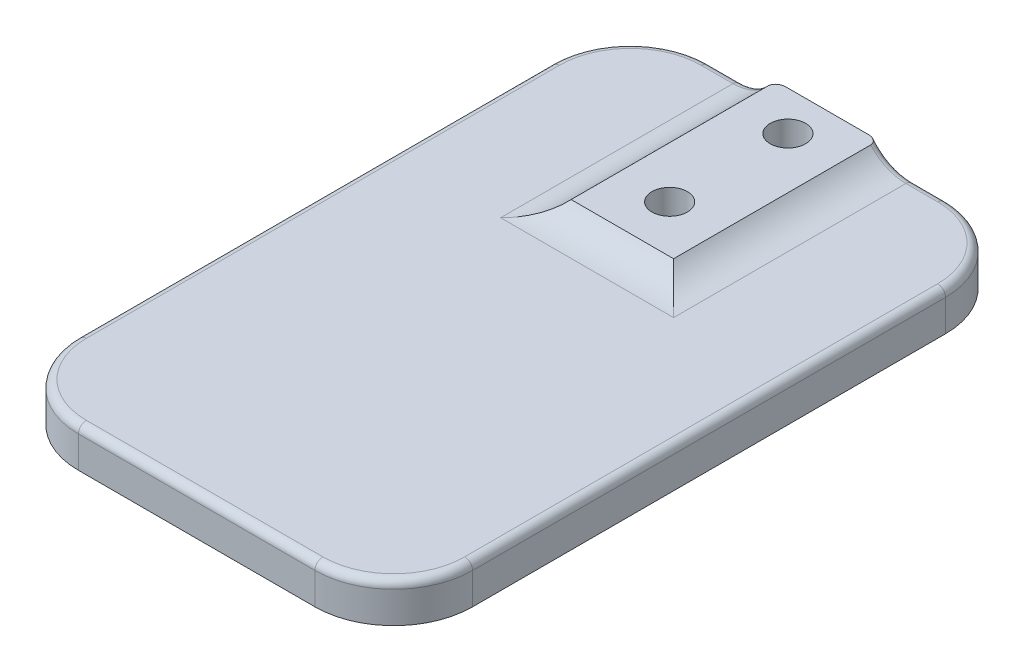
ISO-10303-21;
HEADER;
FILE_DESCRIPTION(('STEP AP214'),'2;1');
FILE_NAME('part.step','',(''),(''),'','','');
FILE_SCHEMA(('AUTOMOTIVE_DESIGN { 1 0 10303 214 1 1 1 1 }'));
ENDSEC;
DATA;
#1=APPLICATION_CONTEXT('core data for automotive mechanical design processes');
#2=APPLICATION_PROTOCOL_DEFINITION('international standard','automotive_design',2000,#1);
#3=PRODUCT_CONTEXT('',#1,'mechanical');
#4=PRODUCT('Part','Part','',(#3));
#5=PRODUCT_RELATED_PRODUCT_CATEGORY('part','',(#4));
#6=PRODUCT_DEFINITION_FORMATION('','',#4);
#7=PRODUCT_DEFINITION_CONTEXT('part definition',#1,'design');
#8=PRODUCT_DEFINITION('design','',#6,#7);
#9=PRODUCT_DEFINITION_SHAPE('','',#8);
#10=(LENGTH_UNIT() NAMED_UNIT(*) SI_UNIT(.MILLI.,.METRE.));
#11=(NAMED_UNIT(*) PLANE_ANGLE_UNIT() SI_UNIT($,.RADIAN.));
#12=(NAMED_UNIT(*) SI_UNIT($,.STERADIAN.) SOLID_ANGLE_UNIT());
#13=UNCERTAINTY_MEASURE_WITH_UNIT(LENGTH_MEASURE(1.E-05),#10,'distance_accuracy_value','');
#14=(GEOMETRIC_REPRESENTATION_CONTEXT(3) GLOBAL_UNCERTAINTY_ASSIGNED_CONTEXT((#13)) GLOBAL_UNIT_ASSIGNED_CONTEXT((#10,
#11,#12)) REPRESENTATION_CONTEXT('',''));
#15=CARTESIAN_POINT('',(0.,0.,0.));
#16=DIRECTION('',(0.,0.,1.));
#17=DIRECTION('',(1.,0.,0.));
#18=AXIS2_PLACEMENT_3D('',#15,#16,#17);
#19=CARTESIAN_POINT('',(25.,5.,-40.));
#20=DIRECTION('',(-1.,0.,0.));
#21=DIRECTION('',(0.,0.,1.));
#22=AXIS2_PLACEMENT_3D('',#19,#20,#21);
#23=PLANE('',#22);
#24=DIRECTION('',(0.,-1.,0.));
#25=VECTOR('',#24,1.);
#26=CARTESIAN_POINT('',(25.,5.,-30.));
#27=LINE('',#26,#25);
#28=CARTESIAN_POINT('',(25.,0.,-30.));
#29=VERTEX_POINT('',#28);
#30=CARTESIAN_POINT('',(25.,4.,-30.));
#31=VERTEX_POINT('',#30);
#32=EDGE_CURVE('E241',#29,#31,#27,.F.);
#33=ORIENTED_EDGE('',*,*,#32,.T.);
#34=DIRECTION('',(0.,0.,-1.));
#35=VECTOR('',#34,1.);
#36=CARTESIAN_POINT('',(25.,4.,30.));
#37=LINE('',#36,#35);
#38=CARTESIAN_POINT('',(25.,4.,30.));
#39=VERTEX_POINT('',#38);
#40=EDGE_CURVE('E460',#31,#39,#37,.F.);
#41=ORIENTED_EDGE('',*,*,#40,.T.);
#42=DIRECTION('',(0.,-1.,0.));
#43=VECTOR('',#42,1.);
#44=CARTESIAN_POINT('',(25.,5.,30.));
#45=LINE('',#44,#43);
#46=CARTESIAN_POINT('',(25.,0.,30.));
#47=VERTEX_POINT('',#46);
#48=EDGE_CURVE('E238',#39,#47,#45,.T.);
#49=ORIENTED_EDGE('',*,*,#48,.T.);
#50=DIRECTION('',(0.,0.,-1.));
#51=VECTOR('',#50,1.);
#52=CARTESIAN_POINT('',(25.,0.,-40.));
#53=LINE('',#52,#51);
#54=EDGE_CURVE('E200',#47,#29,#53,.T.);
#55=ORIENTED_EDGE('',*,*,#54,.T.);
#56=EDGE_LOOP('',(#33,#41,#49,#55));
#57=FACE_BOUND('',#56,.T.);
#58=ADVANCED_FACE('F42',(#57),#23,.F.);
#59=CARTESIAN_POINT('',(-25.,5.,-40.));
#60=DIRECTION('',(0.,0.,1.));
#61=DIRECTION('',(1.,0.,0.));
#62=AXIS2_PLACEMENT_3D('',#59,#60,#61);
#63=PLANE('',#62);
#64=DIRECTION('',(-1.,0.,0.));
#65=VECTOR('',#64,1.);
#66=CARTESIAN_POINT('',(-10.9721359549987,4.,-40.));
#67=LINE('',#66,#65);
#68=CARTESIAN_POINT('',(-15.,4.,-40.));
#69=VERTEX_POINT('',#68);
#70=CARTESIAN_POINT('',(-10.9721359549987,4.,-40.));
#71=VERTEX_POINT('',#70);
#72=EDGE_CURVE('E274',#69,#71,#67,.F.);
#73=ORIENTED_EDGE('',*,*,#72,.T.);
#74=CARTESIAN_POINT('',(-10.9721359549987,11.,-40.));
#75=DIRECTION('',(0.,0.,1.));
#76=DIRECTION('',(1.,0.,0.));
#77=AXIS2_PLACEMENT_3D('',#74,#75,#76);
#78=CIRCLE('',#77,7.);
#79=CARTESIAN_POINT('',(-5.22757330846066,7.,-40.));
#80=VERTEX_POINT('',#79);
#81=EDGE_CURVE('E277',#71,#80,#78,.T.);
#82=ORIENTED_EDGE('',*,*,#81,.T.);
#83=DIRECTION('',(-1.,0.,0.));
#84=VECTOR('',#83,1.);
#85=CARTESIAN_POINT('',(-6.49999999999911,7.,-40.));
#86=LINE('',#85,#84);
#87=CARTESIAN_POINT('',(5.22757330846243,7.,-40.));
#88=VERTEX_POINT('',#87);
#89=EDGE_CURVE('E182',#88,#80,#86,.T.);
#90=ORIENTED_EDGE('',*,*,#89,.F.);
#91=CARTESIAN_POINT('',(10.9721359550005,11.,-40.));
#92=DIRECTION('',(0.,0.,1.));
#93=DIRECTION('',(1.,0.,0.));
#94=AXIS2_PLACEMENT_3D('',#91,#92,#93);
#95=CIRCLE('',#94,7.);
#96=CARTESIAN_POINT('',(10.9721359550005,4.,-40.));
#97=VERTEX_POINT('',#96);
#98=EDGE_CURVE('E271',#88,#97,#95,.T.);
#99=ORIENTED_EDGE('',*,*,#98,.T.);
#100=DIRECTION('',(-1.,0.,0.));
#101=VECTOR('',#100,1.);
#102=CARTESIAN_POINT('',(15.,4.,-40.));
#103=LINE('',#102,#101);
#104=CARTESIAN_POINT('',(15.,4.,-40.));
#105=VERTEX_POINT('',#104);
#106=EDGE_CURVE('E265',#97,#105,#103,.F.);
#107=ORIENTED_EDGE('',*,*,#106,.T.);
#108=DIRECTION('',(0.,-1.,0.));
#109=VECTOR('',#108,1.);
#110=CARTESIAN_POINT('',(15.,5.,-40.));
#111=LINE('',#110,#109);
#112=CARTESIAN_POINT('',(15.,0.,-40.));
#113=VERTEX_POINT('',#112);
#114=EDGE_CURVE('E223',#105,#113,#111,.T.);
#115=ORIENTED_EDGE('',*,*,#114,.T.);
#116=DIRECTION('',(-1.,0.,0.));
#117=VECTOR('',#116,1.);
#118=CARTESIAN_POINT('',(-25.,0.,-40.));
#119=LINE('',#118,#117);
#120=CARTESIAN_POINT('',(-15.,0.,-40.));
#121=VERTEX_POINT('',#120);
#122=EDGE_CURVE('E204',#113,#121,#119,.T.);
#123=ORIENTED_EDGE('',*,*,#122,.T.);
#124=DIRECTION('',(0.,-1.,0.));
#125=VECTOR('',#124,1.);
#126=CARTESIAN_POINT('',(-15.,5.,-40.));
#127=LINE('',#126,#125);
#128=EDGE_CURVE('E219',#121,#69,#127,.F.);
#129=ORIENTED_EDGE('',*,*,#128,.T.);
#130=EDGE_LOOP('',(#73,#82,#90,#99,#107,#115,#123,#129));
#131=FACE_BOUND('',#130,.T.);
#132=ADVANCED_FACE('F321',(#131),#63,.F.);
#133=CARTESIAN_POINT('',(-25.,5.,-40.));
#134=DIRECTION('',(1.,0.,0.));
#135=DIRECTION('',(0.,0.,-1.));
#136=AXIS2_PLACEMENT_3D('',#133,#134,#135);
#137=PLANE('',#136);
#138=DIRECTION('',(0.,-1.,0.));
#139=VECTOR('',#138,1.);
#140=CARTESIAN_POINT('',(-25.,5.,30.));
#141=LINE('',#140,#139);
#142=CARTESIAN_POINT('',(-25.,0.,30.));
#143=VERTEX_POINT('',#142);
#144=CARTESIAN_POINT('',(-25.,4.,30.));
#145=VERTEX_POINT('',#144);
#146=EDGE_CURVE('E254',#143,#145,#141,.F.);
#147=ORIENTED_EDGE('',*,*,#146,.T.);
#148=DIRECTION('',(0.,0.,1.));
#149=VECTOR('',#148,1.);
#150=CARTESIAN_POINT('',(-25.,4.,-30.));
#151=LINE('',#150,#149);
#152=CARTESIAN_POINT('',(-25.,4.,-30.));
#153=VERTEX_POINT('',#152);
#154=EDGE_CURVE('E418',#145,#153,#151,.F.);
#155=ORIENTED_EDGE('',*,*,#154,.T.);
#156=DIRECTION('',(0.,-1.,0.));
#157=VECTOR('',#156,1.);
#158=CARTESIAN_POINT('',(-25.,5.,-30.));
#159=LINE('',#158,#157);
#160=CARTESIAN_POINT('',(-25.,0.,-30.));
#161=VERTEX_POINT('',#160);
#162=EDGE_CURVE('E251',#153,#161,#159,.T.);
#163=ORIENTED_EDGE('',*,*,#162,.T.);
#164=DIRECTION('',(0.,0.,1.));
#165=VECTOR('',#164,1.);
#166=CARTESIAN_POINT('',(-25.,0.,-40.));
#167=LINE('',#166,#165);
#168=EDGE_CURVE('E211',#161,#143,#167,.T.);
#169=ORIENTED_EDGE('',*,*,#168,.T.);
#170=EDGE_LOOP('',(#147,#155,#163,#169));
#171=FACE_BOUND('',#170,.T.);
#172=ADVANCED_FACE('F318',(#171),#137,.F.);
#173=CARTESIAN_POINT('',(-25.,5.,40.));
#174=DIRECTION('',(0.,0.,-1.));
#175=DIRECTION('',(-1.,0.,0.));
#176=AXIS2_PLACEMENT_3D('',#173,#174,#175);
#177=PLANE('',#176);
#178=DIRECTION('',(0.,-1.,0.));
#179=VECTOR('',#178,1.);
#180=CARTESIAN_POINT('',(15.,5.,40.));
#181=LINE('',#180,#179);
#182=CARTESIAN_POINT('',(15.,0.,40.));
#183=VERTEX_POINT('',#182);
#184=CARTESIAN_POINT('',(15.,4.,40.));
#185=VERTEX_POINT('',#184);
#186=EDGE_CURVE('E248',#183,#185,#181,.F.);
#187=ORIENTED_EDGE('',*,*,#186,.T.);
#188=DIRECTION('',(1.,0.,0.));
#189=VECTOR('',#188,1.);
#190=CARTESIAN_POINT('',(-15.,4.,40.));
#191=LINE('',#190,#189);
#192=CARTESIAN_POINT('',(-15.,4.,40.));
#193=VERTEX_POINT('',#192);
#194=EDGE_CURVE('E67',#185,#193,#191,.F.);
#195=ORIENTED_EDGE('',*,*,#194,.T.);
#196=DIRECTION('',(0.,-1.,0.));
#197=VECTOR('',#196,1.);
#198=CARTESIAN_POINT('',(-15.,5.,40.));
#199=LINE('',#198,#197);
#200=CARTESIAN_POINT('',(-15.,0.,40.));
#201=VERTEX_POINT('',#200);
#202=EDGE_CURVE('E245',#193,#201,#199,.T.);
#203=ORIENTED_EDGE('',*,*,#202,.T.);
#204=DIRECTION('',(1.,0.,0.));
#205=VECTOR('',#204,1.);
#206=CARTESIAN_POINT('',(-25.,0.,40.));
#207=LINE('',#206,#205);
#208=EDGE_CURVE('E215',#201,#183,#207,.T.);
#209=ORIENTED_EDGE('',*,*,#208,.T.);
#210=EDGE_LOOP('',(#187,#195,#203,#209));
#211=FACE_BOUND('',#210,.T.);
#212=ADVANCED_FACE('F311',(#211),#177,.F.);
#213=CARTESIAN_POINT('',(0.,5.,0.));
#214=DIRECTION('',(0.,1.,0.));
#215=DIRECTION('',(0.,0.,1.));
#216=AXIS2_PLACEMENT_3D('',#213,#214,#215);
#217=PLANE('',#216);
#218=DIRECTION('',(0.,0.,1.));
#219=VECTOR('',#218,1.);
#220=CARTESIAN_POINT('',(-10.9721359549987,5.,-40.));
#221=LINE('',#220,#219);
#222=CARTESIAN_POINT('',(-10.9721359549987,5.,-9.52786404499976));
#223=VERTEX_POINT('',#222);
#224=CARTESIAN_POINT('',(-10.9721359549987,5.,-39.));
#225=VERTEX_POINT('',#224);
#226=EDGE_CURVE('E189',#223,#225,#221,.F.);
#227=ORIENTED_EDGE('',*,*,#226,.T.);
#228=DIRECTION('',(-1.,0.,0.));
#229=VECTOR('',#228,1.);
#230=CARTESIAN_POINT('',(-15.,5.,-39.));
#231=LINE('',#230,#229);
#232=CARTESIAN_POINT('',(-15.,5.,-39.));
#233=VERTEX_POINT('',#232);
#234=EDGE_CURVE('E448',#225,#233,#231,.T.);
#235=ORIENTED_EDGE('',*,*,#234,.T.);
#236=CARTESIAN_POINT('',(-15.,5.,-30.));
#237=DIRECTION('',(0.,1.,0.));
#238=DIRECTION('',(0.,0.,1.));
#239=AXIS2_PLACEMENT_3D('',#236,#237,#238);
#240=CIRCLE('',#239,9.);
#241=CARTESIAN_POINT('',(-24.,5.,-30.));
#242=VERTEX_POINT('',#241);
#243=EDGE_CURVE('E454',#233,#242,#240,.T.);
#244=ORIENTED_EDGE('',*,*,#243,.T.);
#245=DIRECTION('',(0.,0.,1.));
#246=VECTOR('',#245,1.);
#247=CARTESIAN_POINT('',(-24.,5.,30.));
#248=LINE('',#247,#246);
#249=CARTESIAN_POINT('',(-24.,5.,30.));
#250=VERTEX_POINT('',#249);
#251=EDGE_CURVE('E519',#242,#250,#248,.T.);
#252=ORIENTED_EDGE('',*,*,#251,.T.);
#253=CARTESIAN_POINT('',(-15.,5.,30.));
#254=DIRECTION('',(0.,1.,0.));
#255=DIRECTION('',(0.,0.,1.));
#256=AXIS2_PLACEMENT_3D('',#253,#254,#255);
#257=CIRCLE('',#256,9.);
#258=CARTESIAN_POINT('',(-15.,5.,39.));
#259=VERTEX_POINT('',#258);
#260=EDGE_CURVE('E525',#250,#259,#257,.T.);
#261=ORIENTED_EDGE('',*,*,#260,.T.);
#262=DIRECTION('',(1.,0.,0.));
#263=VECTOR('',#262,1.);
#264=CARTESIAN_POINT('',(15.,5.,39.));
#265=LINE('',#264,#263);
#266=CARTESIAN_POINT('',(15.,5.,39.));
#267=VERTEX_POINT('',#266);
#268=EDGE_CURVE('E530',#259,#267,#265,.T.);
#269=ORIENTED_EDGE('',*,*,#268,.T.);
#270=CARTESIAN_POINT('',(15.,5.,30.));
#271=DIRECTION('',(0.,1.,0.));
#272=DIRECTION('',(0.,0.,1.));
#273=AXIS2_PLACEMENT_3D('',#270,#271,#272);
#274=CIRCLE('',#273,9.);
#275=CARTESIAN_POINT('',(24.,5.,30.));
#276=VERTEX_POINT('',#275);
#277=EDGE_CURVE('E513',#267,#276,#274,.T.);
#278=ORIENTED_EDGE('',*,*,#277,.T.);
#279=DIRECTION('',(0.,0.,-1.));
#280=VECTOR('',#279,1.);
#281=CARTESIAN_POINT('',(24.,5.,-30.));
#282=LINE('',#281,#280);
#283=CARTESIAN_POINT('',(24.,5.,-30.));
#284=VERTEX_POINT('',#283);
#285=EDGE_CURVE('E504',#276,#284,#282,.T.);
#286=ORIENTED_EDGE('',*,*,#285,.T.);
#287=CARTESIAN_POINT('',(15.,5.,-30.));
#288=DIRECTION('',(0.,1.,0.));
#289=DIRECTION('',(0.,0.,1.));
#290=AXIS2_PLACEMENT_3D('',#287,#288,#289);
#291=CIRCLE('',#290,9.);
#292=CARTESIAN_POINT('',(15.,5.,-39.));
#293=VERTEX_POINT('',#292);
#294=EDGE_CURVE('E507',#284,#293,#291,.T.);
#295=ORIENTED_EDGE('',*,*,#294,.T.);
#296=DIRECTION('',(-1.,0.,0.));
#297=VECTOR('',#296,1.);
#298=CARTESIAN_POINT('',(10.9721359550005,5.,-39.));
#299=LINE('',#298,#297);
#300=CARTESIAN_POINT('',(10.9721359550005,5.,-39.));
#301=VERTEX_POINT('',#300);
#302=EDGE_CURVE('E401',#293,#301,#299,.T.);
#303=ORIENTED_EDGE('',*,*,#302,.T.);
#304=DIRECTION('',(0.,0.,-1.));
#305=VECTOR('',#304,1.);
#306=CARTESIAN_POINT('',(10.9721359550005,5.,-13.9999999999993));
#307=LINE('',#306,#305);
#308=CARTESIAN_POINT('',(10.9721359550005,5.,-9.52786404499976));
#309=VERTEX_POINT('',#308);
#310=EDGE_CURVE('E262',#301,#309,#307,.F.);
#311=ORIENTED_EDGE('',*,*,#310,.T.);
#312=DIRECTION('',(1.,0.,0.));
#313=VECTOR('',#312,1.);
#314=CARTESIAN_POINT('',(-6.49999999999911,5.,-9.52786404499976));
#315=LINE('',#314,#313);
#316=EDGE_CURVE('E259',#309,#223,#315,.F.);
#317=ORIENTED_EDGE('',*,*,#316,.T.);
#318=EDGE_LOOP('',(#227,#235,#244,#252,#261,#269,#278,#286,#295,#303,#311,#317));
#319=FACE_BOUND('',#318,.T.);
#320=ADVANCED_FACE('F307',(#319),#217,.T.);
#321=CARTESIAN_POINT('',(0.,0.,0.));
#322=DIRECTION('',(0.,1.,0.));
#323=DIRECTION('',(0.,0.,1.));
#324=AXIS2_PLACEMENT_3D('',#321,#322,#323);
#325=PLANE('',#324);
#326=CARTESIAN_POINT('',(0.,0.,-35.));
#327=DIRECTION('',(0.,1.,0.));
#328=DIRECTION('',(0.,0.,1.));
#329=AXIS2_PLACEMENT_3D('',#326,#327,#328);
#330=CIRCLE('',#329,4.65000000000002);
#331=CARTESIAN_POINT('',(0.,0.,-30.35));
#332=VERTEX_POINT('',#331);
#333=EDGE_CURVE('E417',#332,#332,#330,.T.);
#334=ORIENTED_EDGE('',*,*,#333,.T.);
#335=EDGE_LOOP('',(#334));
#336=FACE_BOUND('',#335,.T.);
#337=CARTESIAN_POINT('',(0.,0.,-20.));
#338=DIRECTION('',(0.,1.,0.));
#339=DIRECTION('',(0.,0.,1.));
#340=AXIS2_PLACEMENT_3D('',#337,#338,#339);
#341=CIRCLE('',#340,4.64999999999999);
#342=CARTESIAN_POINT('',(0.,0.,-15.35));
#343=VERTEX_POINT('',#342);
#344=EDGE_CURVE('E413',#343,#343,#341,.T.);
#345=ORIENTED_EDGE('',*,*,#344,.T.);
#346=EDGE_LOOP('',(#345));
#347=FACE_BOUND('',#346,.T.);
#348=ORIENTED_EDGE('',*,*,#122,.F.);
#349=CARTESIAN_POINT('',(15.,0.,-30.));
#350=DIRECTION('',(0.,1.,0.));
#351=DIRECTION('',(0.,0.,1.));
#352=AXIS2_PLACEMENT_3D('',#349,#350,#351);
#353=CIRCLE('',#352,10.);
#354=EDGE_CURVE('E235',#113,#29,#353,.F.);
#355=ORIENTED_EDGE('',*,*,#354,.T.);
#356=ORIENTED_EDGE('',*,*,#54,.F.);
#357=CARTESIAN_POINT('',(15.,0.,30.));
#358=DIRECTION('',(0.,1.,0.));
#359=DIRECTION('',(0.,0.,1.));
#360=AXIS2_PLACEMENT_3D('',#357,#358,#359);
#361=CIRCLE('',#360,10.);
#362=EDGE_CURVE('E232',#47,#183,#361,.F.);
#363=ORIENTED_EDGE('',*,*,#362,.T.);
#364=ORIENTED_EDGE('',*,*,#208,.F.);
#365=CARTESIAN_POINT('',(-15.,0.,30.));
#366=DIRECTION('',(0.,1.,0.));
#367=DIRECTION('',(0.,0.,1.));
#368=AXIS2_PLACEMENT_3D('',#365,#366,#367);
#369=CIRCLE('',#368,10.);
#370=EDGE_CURVE('E229',#201,#143,#369,.F.);
#371=ORIENTED_EDGE('',*,*,#370,.T.);
#372=ORIENTED_EDGE('',*,*,#168,.F.);
#373=CARTESIAN_POINT('',(-15.,0.,-30.));
#374=DIRECTION('',(0.,1.,0.));
#375=DIRECTION('',(0.,0.,1.));
#376=AXIS2_PLACEMENT_3D('',#373,#374,#375);
#377=CIRCLE('',#376,10.);
#378=EDGE_CURVE('E226',#161,#121,#377,.F.);
#379=ORIENTED_EDGE('',*,*,#378,.T.);
#380=EDGE_LOOP('',(#348,#355,#356,#363,#364,#371,#372,#379));
#381=FACE_BOUND('',#380,.T.);
#382=ADVANCED_FACE('F304',(#336,#347,#381),#325,.F.);
#383=CARTESIAN_POINT('',(0.,7.,0.));
#384=DIRECTION('',(0.,-1.,0.));
#385=DIRECTION('',(0.,0.,-1.));
#386=AXIS2_PLACEMENT_3D('',#383,#384,#385);
#387=PLANE('',#386);
#388=CARTESIAN_POINT('',(0.,7.,-35.));
#389=DIRECTION('',(0.,1.,0.));
#390=DIRECTION('',(0.,0.,1.));
#391=AXIS2_PLACEMENT_3D('',#388,#389,#390);
#392=CIRCLE('',#391,2.25);
#393=CARTESIAN_POINT('',(0.,7.,-32.75));
#394=VERTEX_POINT('',#393);
#395=EDGE_CURVE('E555',#394,#394,#392,.T.);
#396=ORIENTED_EDGE('',*,*,#395,.F.);
#397=EDGE_LOOP('',(#396));
#398=FACE_BOUND('',#397,.T.);
#399=CARTESIAN_POINT('',(0.,7.,-20.));
#400=DIRECTION('',(0.,1.,0.));
#401=DIRECTION('',(0.,0.,1.));
#402=AXIS2_PLACEMENT_3D('',#399,#400,#401);
#403=CIRCLE('',#402,2.25);
#404=CARTESIAN_POINT('',(0.,7.,-17.75));
#405=VERTEX_POINT('',#404);
#406=EDGE_CURVE('E193',#405,#405,#403,.T.);
#407=ORIENTED_EDGE('',*,*,#406,.F.);
#408=EDGE_LOOP('',(#407));
#409=FACE_BOUND('',#408,.T.);
#410=ORIENTED_EDGE('',*,*,#89,.T.);
#411=CARTESIAN_POINT('',(-5.22757330846066,7.,-40.));
#412=CARTESIAN_POINT('',(-5.31218436696525,7.,-39.9999572097328));
#413=CARTESIAN_POINT('',(-5.39679405095857,7.,-39.992763275864));
#414=CARTESIAN_POINT('',(-5.56427663479689,7.,-39.964317357309));
#415=CARTESIAN_POINT('',(-5.64713150329684,7.,-39.9429592021294));
#416=CARTESIAN_POINT('',(-5.80798814044717,7.,-39.8864491257726));
#417=CARTESIAN_POINT('',(-5.8859915270889,7.,-39.8513018322249));
#418=CARTESIAN_POINT('',(-6.03407136235752,7.,-39.7672637397689));
#419=CARTESIAN_POINT('',(-6.10417375514118,7.,-39.7184198752765));
#420=CARTESIAN_POINT('',(-6.21044209037377,7.,-39.6261423973338));
#421=CARTESIAN_POINT('',(-6.25000134362256,7.,-39.586598338663));
#422=CARTESIAN_POINT('',(-6.32236665913547,7.,-39.5017207429351));
#423=CARTESIAN_POINT('',(-6.35518121048792,7.,-39.4563946013506));
#424=CARTESIAN_POINT('',(-6.40714772390656,7.,-39.3688653325679));
#425=CARTESIAN_POINT('',(-6.42768244729932,7.,-39.3274853017424));
#426=CARTESIAN_POINT('',(-6.46157896103236,7.,-39.2419098203217));
#427=CARTESIAN_POINT('',(-6.4749554482319,7.,-39.1977203483597));
#428=CARTESIAN_POINT('',(-6.48947043945153,7.,-39.1276268971672));
#429=CARTESIAN_POINT('',(-6.49340493646582,7.,-39.102278244798));
#430=CARTESIAN_POINT('',(-6.49867464708532,7.,-39.0512922491416));
#431=CARTESIAN_POINT('',(-6.50000774772438,7.,-39.0256546881742));
#432=CARTESIAN_POINT('',(-6.49999999999911,7.,-39.));
#433=B_SPLINE_CURVE_WITH_KNOTS('',3,(#411,#412,#413,#414,#415,#416,#417,#418,#419,#420,#421,
#422,#423,#424,#425,#426,#427,#428,#429,#430,#431,#432),.UNSPECIFIED.,.F.,.F.,(4,2,2,2,2,2,2,2,
2,2,4),(0.,0.253550994624207,0.509024338504201,0.764412018868951,1.01893503065254,
1.18616716680131,1.35318751285431,1.4912229328746,1.62897384884644,1.70580915518309,
1.78270684453003),.UNSPECIFIED.);
#434=CARTESIAN_POINT('',(-6.49999999999911,7.,-39.));
#435=VERTEX_POINT('',#434);
#436=EDGE_CURVE('E178',#80,#435,#433,.T.);
#437=ORIENTED_EDGE('',*,*,#436,.T.);
#438=DIRECTION('',(0.,0.,1.));
#439=VECTOR('',#438,1.);
#440=CARTESIAN_POINT('',(-6.49999999999911,7.,-13.9999999999993));
#441=LINE('',#440,#439);
#442=CARTESIAN_POINT('',(-6.49999999999911,7.,-13.9999999999993));
#443=VERTEX_POINT('',#442);
#444=EDGE_CURVE('E170',#435,#443,#441,.T.);
#445=ORIENTED_EDGE('',*,*,#444,.T.);
#446=DIRECTION('',(1.,0.,0.));
#447=VECTOR('',#446,1.);
#448=CARTESIAN_POINT('',(-6.49999999999911,7.,-13.9999999999993));
#449=LINE('',#448,#447);
#450=CARTESIAN_POINT('',(6.50000000000089,7.,-13.9999999999993));
#451=VERTEX_POINT('',#450);
#452=EDGE_CURVE('E176',#443,#451,#449,.T.);
#453=ORIENTED_EDGE('',*,*,#452,.T.);
#454=DIRECTION('',(0.,0.,-1.));
#455=VECTOR('',#454,1.);
#456=CARTESIAN_POINT('',(6.50000000000089,7.,-13.9999999999993));
#457=LINE('',#456,#455);
#458=CARTESIAN_POINT('',(6.50000000000089,7.,-39.));
#459=VERTEX_POINT('',#458);
#460=EDGE_CURVE('E553',#451,#459,#457,.T.);
#461=ORIENTED_EDGE('',*,*,#460,.T.);
#462=CARTESIAN_POINT('',(6.50000000000089,7.,-39.));
#463=CARTESIAN_POINT('',(6.50000449826011,7.,-39.0234011522832));
#464=CARTESIAN_POINT('',(6.49889700539802,7.,-39.0467880998812));
#465=CARTESIAN_POINT('',(6.49450991604656,7.,-39.093339788144));
#466=CARTESIAN_POINT('',(6.49123198653924,7.,-39.1165046855112));
#467=CARTESIAN_POINT('',(6.47829592403575,7.,-39.1850154257283));
#468=CARTESIAN_POINT('',(6.46553341465789,7.,-39.2298055649736));
#469=CARTESIAN_POINT('',(6.43271143611399,7.,-39.3164143014299));
#470=CARTESIAN_POINT('',(6.41267179985191,7.,-39.3582406093925));
#471=CARTESIAN_POINT('',(6.36645568683535,7.,-39.4384289924918));
#472=CARTESIAN_POINT('',(6.34026547090611,7.,-39.4767830415844));
#473=CARTESIAN_POINT('',(6.27203775565736,7.,-39.5633748961934));
#474=CARTESIAN_POINT('',(6.22775702636054,7.,-39.6098451159085));
#475=CARTESIAN_POINT('',(6.13226747575128,7.,-39.6950149687189));
#476=CARTESIAN_POINT('',(6.08104663946532,7.,-39.7337008300232));
#477=CARTESIAN_POINT('',(5.96014160409359,7.,-39.8119669199484));
#478=CARTESIAN_POINT('',(5.88904094033407,7.,-39.8493578530595));
#479=CARTESIAN_POINT('',(5.74171218893063,7.,-39.9119797222805));
#480=CARTESIAN_POINT('',(5.66548268069208,7.,-39.9372072734276));
#481=CARTESIAN_POINT('',(5.5288005629267,7.,-39.9707608830408));
#482=CARTESIAN_POINT('',(5.46897367349475,7.,-39.9816950653583));
#483=CARTESIAN_POINT('',(5.34862997766931,7.,-39.9962967626379));
#484=CARTESIAN_POINT('',(5.28811590028555,7.,-39.9999868031388));
#485=CARTESIAN_POINT('',(5.22757330846244,7.,-40.));
#486=B_SPLINE_CURVE_WITH_KNOTS('',3,(#462,#463,#464,#465,#466,#467,#468,#469,#470,#471,#472,
#473,#474,#475,#476,#477,#478,#479,#480,#481,#482,#483,#484,#485),.UNSPECIFIED.,.F.,.F.,(4,2,2,
2,2,2,2,2,2,2,2,4),(0.,0.070150414102945,0.140247012284642,0.279175239474848,0.417727642344912,
0.556592538204348,0.748118446291941,0.939980271889822,1.17975574389847,1.41959790486153,
1.60163276750004,1.78310069353373),.UNSPECIFIED.);
#487=EDGE_CURVE('E281',#459,#88,#486,.T.);
#488=ORIENTED_EDGE('',*,*,#487,.T.);
#489=EDGE_LOOP('',(#410,#437,#445,#453,#461,#488));
#490=FACE_BOUND('',#489,.T.);
#491=ADVANCED_FACE('F173',(#398,#409,#490),#387,.F.);
#492=CARTESIAN_POINT('',(0.,0.,-20.));
#493=DIRECTION('',(0.,1.,0.));
#494=DIRECTION('',(0.,0.,1.));
#495=AXIS2_PLACEMENT_3D('',#492,#493,#494);
#496=CYLINDRICAL_SURFACE('',#495,2.25);
#497=CARTESIAN_POINT('',(0.,2.4,-20.));
#498=DIRECTION('',(0.,1.,0.));
#499=DIRECTION('',(0.,0.,1.));
#500=AXIS2_PLACEMENT_3D('',#497,#498,#499);
#501=CIRCLE('',#500,2.25);
#502=CARTESIAN_POINT('',(0.,2.4,-17.75));
#503=VERTEX_POINT('',#502);
#504=EDGE_CURVE('E11',#503,#503,#501,.F.);
#505=ORIENTED_EDGE('',*,*,#504,.T.);
#506=EDGE_LOOP('',(#505));
#507=FACE_BOUND('',#506,.T.);
#508=ORIENTED_EDGE('',*,*,#406,.T.);
#509=EDGE_LOOP('',(#508));
#510=FACE_BOUND('',#509,.T.);
#511=ADVANCED_FACE('F303',(#507,#510),#496,.F.);
#512=CARTESIAN_POINT('',(0.,0.,-35.));
#513=DIRECTION('',(0.,1.,0.));
#514=DIRECTION('',(0.,0.,1.));
#515=AXIS2_PLACEMENT_3D('',#512,#513,#514);
#516=CYLINDRICAL_SURFACE('',#515,2.25);
#517=CARTESIAN_POINT('',(0.,2.40000000000002,-35.));
#518=DIRECTION('',(0.,1.,0.));
#519=DIRECTION('',(0.,0.,1.));
#520=AXIS2_PLACEMENT_3D('',#517,#518,#519);
#521=CIRCLE('',#520,2.25);
#522=CARTESIAN_POINT('',(0.,2.40000000000002,-32.75));
#523=VERTEX_POINT('',#522);
#524=EDGE_CURVE('E52',#523,#523,#521,.F.);
#525=ORIENTED_EDGE('',*,*,#524,.T.);
#526=EDGE_LOOP('',(#525));
#527=FACE_BOUND('',#526,.T.);
#528=ORIENTED_EDGE('',*,*,#395,.T.);
#529=EDGE_LOOP('',(#528));
#530=FACE_BOUND('',#529,.T.);
#531=ADVANCED_FACE('F333',(#527,#530),#516,.F.);
#532=CARTESIAN_POINT('',(15.,5.,-30.));
#533=DIRECTION('',(0.,-1.,0.));
#534=DIRECTION('',(0.,0.,-1.));
#535=AXIS2_PLACEMENT_3D('',#532,#533,#534);
#536=CYLINDRICAL_SURFACE('',#535,10.);
#537=ORIENTED_EDGE('',*,*,#114,.F.);
#538=CARTESIAN_POINT('',(15.,4.,-30.));
#539=DIRECTION('',(0.,1.,0.));
#540=DIRECTION('',(0.,0.,1.));
#541=AXIS2_PLACEMENT_3D('',#538,#539,#540);
#542=CIRCLE('',#541,10.);
#543=EDGE_CURVE('E452',#105,#31,#542,.F.);
#544=ORIENTED_EDGE('',*,*,#543,.T.);
#545=ORIENTED_EDGE('',*,*,#32,.F.);
#546=ORIENTED_EDGE('',*,*,#354,.F.);
#547=EDGE_LOOP('',(#537,#544,#545,#546));
#548=FACE_BOUND('',#547,.T.);
#549=ADVANCED_FACE('F329',(#548),#536,.T.);
#550=CARTESIAN_POINT('',(15.,5.,30.));
#551=DIRECTION('',(0.,-1.,0.));
#552=DIRECTION('',(0.,0.,-1.));
#553=AXIS2_PLACEMENT_3D('',#550,#551,#552);
#554=CYLINDRICAL_SURFACE('',#553,10.);
#555=ORIENTED_EDGE('',*,*,#48,.F.);
#556=CARTESIAN_POINT('',(15.,4.,30.));
#557=DIRECTION('',(0.,1.,0.));
#558=DIRECTION('',(0.,0.,1.));
#559=AXIS2_PLACEMENT_3D('',#556,#557,#558);
#560=CIRCLE('',#559,10.);
#561=EDGE_CURVE('E463',#39,#185,#560,.F.);
#562=ORIENTED_EDGE('',*,*,#561,.T.);
#563=ORIENTED_EDGE('',*,*,#186,.F.);
#564=ORIENTED_EDGE('',*,*,#362,.F.);
#565=EDGE_LOOP('',(#555,#562,#563,#564));
#566=FACE_BOUND('',#565,.T.);
#567=ADVANCED_FACE('F332',(#566),#554,.T.);
#568=CARTESIAN_POINT('',(-15.,5.,30.));
#569=DIRECTION('',(0.,-1.,0.));
#570=DIRECTION('',(0.,0.,-1.));
#571=AXIS2_PLACEMENT_3D('',#568,#569,#570);
#572=CYLINDRICAL_SURFACE('',#571,10.);
#573=ORIENTED_EDGE('',*,*,#202,.F.);
#574=CARTESIAN_POINT('',(-15.,4.,30.));
#575=DIRECTION('',(0.,1.,0.));
#576=DIRECTION('',(0.,0.,1.));
#577=AXIS2_PLACEMENT_3D('',#574,#575,#576);
#578=CIRCLE('',#577,10.);
#579=EDGE_CURVE('E59',#193,#145,#578,.F.);
#580=ORIENTED_EDGE('',*,*,#579,.T.);
#581=ORIENTED_EDGE('',*,*,#146,.F.);
#582=ORIENTED_EDGE('',*,*,#370,.F.);
#583=EDGE_LOOP('',(#573,#580,#581,#582));
#584=FACE_BOUND('',#583,.T.);
#585=ADVANCED_FACE('F337',(#584),#572,.T.);
#586=CARTESIAN_POINT('',(-15.,5.,-30.));
#587=DIRECTION('',(0.,-1.,0.));
#588=DIRECTION('',(0.,0.,-1.));
#589=AXIS2_PLACEMENT_3D('',#586,#587,#588);
#590=CYLINDRICAL_SURFACE('',#589,10.);
#591=ORIENTED_EDGE('',*,*,#162,.F.);
#592=CARTESIAN_POINT('',(-15.,4.,-30.));
#593=DIRECTION('',(0.,1.,0.));
#594=DIRECTION('',(0.,0.,1.));
#595=AXIS2_PLACEMENT_3D('',#592,#593,#594);
#596=CIRCLE('',#595,10.);
#597=EDGE_CURVE('E443',#153,#69,#596,.F.);
#598=ORIENTED_EDGE('',*,*,#597,.T.);
#599=ORIENTED_EDGE('',*,*,#128,.F.);
#600=ORIENTED_EDGE('',*,*,#378,.F.);
#601=EDGE_LOOP('',(#591,#598,#599,#600));
#602=FACE_BOUND('',#601,.T.);
#603=ADVANCED_FACE('F341',(#602),#590,.T.);
#604=CARTESIAN_POINT('',(-10.9721359549987,11.,-13.9999999999993));
#605=DIRECTION('',(0.,0.,-1.));
#606=DIRECTION('',(-1.,0.,0.));
#607=AXIS2_PLACEMENT_3D('',#604,#605,#606);
#608=CYLINDRICAL_SURFACE('',#607,6.);
#609=ORIENTED_EDGE('',*,*,#444,.F.);
#610=CARTESIAN_POINT('',(-10.9721359549987,11.,-39.));
#611=DIRECTION('',(0.,0.,1.));
#612=DIRECTION('',(1.,0.,0.));
#613=AXIS2_PLACEMENT_3D('',#610,#611,#612);
#614=CIRCLE('',#613,6.);
#615=EDGE_CURVE('E526',#435,#225,#614,.F.);
#616=ORIENTED_EDGE('',*,*,#615,.T.);
#617=ORIENTED_EDGE('',*,*,#226,.F.);
#618=CARTESIAN_POINT('',(-10.9721359549987,11.,-9.52786404499976));
#619=DIRECTION('',(-0.707106781186547,0.,-0.707106781186547));
#620=DIRECTION('',(0.707106781186547,0.,-0.707106781186547));
#621=AXIS2_PLACEMENT_3D('',#618,#619,#620);
#622=ELLIPSE('',#621,8.48528137423857,6.);
#623=EDGE_CURVE('E186',#443,#223,#622,.T.);
#624=ORIENTED_EDGE('',*,*,#623,.F.);
#625=EDGE_LOOP('',(#609,#616,#617,#624));
#626=FACE_BOUND('',#625,.T.);
#627=ADVANCED_FACE('F187',(#626),#608,.F.);
#628=CARTESIAN_POINT('',(-6.49999999999911,11.,-9.52786404499976));
#629=DIRECTION('',(-1.,0.,0.));
#630=DIRECTION('',(0.,0.,1.));
#631=AXIS2_PLACEMENT_3D('',#628,#629,#630);
#632=CYLINDRICAL_SURFACE('',#631,6.);
#633=ORIENTED_EDGE('',*,*,#623,.T.);
#634=ORIENTED_EDGE('',*,*,#316,.F.);
#635=CARTESIAN_POINT('',(10.9721359550005,11.,-9.52786404499976));
#636=DIRECTION('',(-0.707106781186547,0.,0.707106781186547));
#637=DIRECTION('',(-0.707106781186547,0.,-0.707106781186547));
#638=AXIS2_PLACEMENT_3D('',#635,#636,#637);
#639=ELLIPSE('',#638,8.48528137423857,6.);
#640=EDGE_CURVE('E194',#451,#309,#639,.T.);
#641=ORIENTED_EDGE('',*,*,#640,.F.);
#642=ORIENTED_EDGE('',*,*,#452,.F.);
#643=EDGE_LOOP('',(#633,#634,#641,#642));
#644=FACE_BOUND('',#643,.T.);
#645=ADVANCED_FACE('F196',(#644),#632,.F.);
#646=CARTESIAN_POINT('',(10.9721359550005,11.,-13.9999999999993));
#647=DIRECTION('',(0.,0.,1.));
#648=DIRECTION('',(1.,0.,0.));
#649=AXIS2_PLACEMENT_3D('',#646,#647,#648);
#650=CYLINDRICAL_SURFACE('',#649,6.);
#651=ORIENTED_EDGE('',*,*,#310,.F.);
#652=CARTESIAN_POINT('',(10.9721359550005,11.,-39.));
#653=DIRECTION('',(0.,0.,1.));
#654=DIRECTION('',(1.,0.,0.));
#655=AXIS2_PLACEMENT_3D('',#652,#653,#654);
#656=CIRCLE('',#655,6.);
#657=EDGE_CURVE('E447',#301,#459,#656,.F.);
#658=ORIENTED_EDGE('',*,*,#657,.T.);
#659=ORIENTED_EDGE('',*,*,#460,.F.);
#660=ORIENTED_EDGE('',*,*,#640,.T.);
#661=EDGE_LOOP('',(#651,#658,#659,#660));
#662=FACE_BOUND('',#661,.T.);
#663=ADVANCED_FACE('F345',(#662),#650,.F.);
#664=CARTESIAN_POINT('',(10.9721359550005,11.,-39.));
#665=DIRECTION('',(0.,0.,1.));
#666=DIRECTION('',(1.,0.,0.));
#667=AXIS2_PLACEMENT_3D('',#664,#665,#666);
#668=TOROIDAL_SURFACE('',#667,7.,1.);
#669=ORIENTED_EDGE('',*,*,#487,.F.);
#670=ORIENTED_EDGE('',*,*,#657,.F.);
#671=CARTESIAN_POINT('',(10.9721359550005,4.,-39.));
#672=DIRECTION('',(1.,0.,0.));
#673=DIRECTION('',(0.,0.,-1.));
#674=AXIS2_PLACEMENT_3D('',#671,#672,#673);
#675=CIRCLE('',#674,1.);
#676=EDGE_CURVE('E267',#97,#301,#675,.T.);
#677=ORIENTED_EDGE('',*,*,#676,.F.);
#678=ORIENTED_EDGE('',*,*,#98,.F.);
#679=EDGE_LOOP('',(#669,#670,#677,#678));
#680=FACE_BOUND('',#679,.T.);
#681=ADVANCED_FACE('F296',(#680),#668,.T.);
#682=CARTESIAN_POINT('',(0.,4.,-39.));
#683=DIRECTION('',(1.,0.,0.));
#684=DIRECTION('',(0.,0.,-1.));
#685=AXIS2_PLACEMENT_3D('',#682,#683,#684);
#686=CYLINDRICAL_SURFACE('',#685,1.);
#687=ORIENTED_EDGE('',*,*,#676,.T.);
#688=ORIENTED_EDGE('',*,*,#302,.F.);
#689=CARTESIAN_POINT('',(15.,4.,-39.));
#690=DIRECTION('',(1.,0.,0.));
#691=DIRECTION('',(0.,0.,-1.));
#692=AXIS2_PLACEMENT_3D('',#689,#690,#691);
#693=CIRCLE('',#692,1.);
#694=EDGE_CURVE('E406',#105,#293,#693,.T.);
#695=ORIENTED_EDGE('',*,*,#694,.F.);
#696=ORIENTED_EDGE('',*,*,#106,.F.);
#697=EDGE_LOOP('',(#687,#688,#695,#696));
#698=FACE_BOUND('',#697,.T.);
#699=ADVANCED_FACE('F388',(#698),#686,.T.);
#700=CARTESIAN_POINT('',(15.,4.,-30.));
#701=DIRECTION('',(0.,1.,0.));
#702=DIRECTION('',(0.,0.,1.));
#703=AXIS2_PLACEMENT_3D('',#700,#701,#702);
#704=TOROIDAL_SURFACE('',#703,9.,1.);
#705=ORIENTED_EDGE('',*,*,#694,.T.);
#706=ORIENTED_EDGE('',*,*,#294,.F.);
#707=CARTESIAN_POINT('',(24.,4.,-30.));
#708=DIRECTION('',(0.,0.,1.));
#709=DIRECTION('',(1.,0.,0.));
#710=AXIS2_PLACEMENT_3D('',#707,#708,#709);
#711=CIRCLE('',#710,1.);
#712=EDGE_CURVE('E409',#31,#284,#711,.T.);
#713=ORIENTED_EDGE('',*,*,#712,.F.);
#714=ORIENTED_EDGE('',*,*,#543,.F.);
#715=EDGE_LOOP('',(#705,#706,#713,#714));
#716=FACE_BOUND('',#715,.T.);
#717=ADVANCED_FACE('F385',(#716),#704,.T.);
#718=CARTESIAN_POINT('',(24.,4.,0.));
#719=DIRECTION('',(0.,0.,1.));
#720=DIRECTION('',(1.,0.,0.));
#721=AXIS2_PLACEMENT_3D('',#718,#719,#720);
#722=CYLINDRICAL_SURFACE('',#721,1.);
#723=ORIENTED_EDGE('',*,*,#712,.T.);
#724=ORIENTED_EDGE('',*,*,#285,.F.);
#725=CARTESIAN_POINT('',(24.,4.,30.));
#726=DIRECTION('',(0.,0.,1.));
#727=DIRECTION('',(1.,0.,0.));
#728=AXIS2_PLACEMENT_3D('',#725,#726,#727);
#729=CIRCLE('',#728,1.);
#730=EDGE_CURVE('E495',#39,#276,#729,.T.);
#731=ORIENTED_EDGE('',*,*,#730,.F.);
#732=ORIENTED_EDGE('',*,*,#40,.F.);
#733=EDGE_LOOP('',(#723,#724,#731,#732));
#734=FACE_BOUND('',#733,.T.);
#735=ADVANCED_FACE('F381',(#734),#722,.T.);
#736=CARTESIAN_POINT('',(15.,4.,30.));
#737=DIRECTION('',(0.,1.,0.));
#738=DIRECTION('',(0.,0.,1.));
#739=AXIS2_PLACEMENT_3D('',#736,#737,#738);
#740=TOROIDAL_SURFACE('',#739,9.,1.);
#741=ORIENTED_EDGE('',*,*,#730,.T.);
#742=ORIENTED_EDGE('',*,*,#277,.F.);
#743=CARTESIAN_POINT('',(15.,4.,39.));
#744=DIRECTION('',(-1.,0.,0.));
#745=DIRECTION('',(0.,0.,1.));
#746=AXIS2_PLACEMENT_3D('',#743,#744,#745);
#747=CIRCLE('',#746,1.);
#748=EDGE_CURVE('E491',#185,#267,#747,.T.);
#749=ORIENTED_EDGE('',*,*,#748,.F.);
#750=ORIENTED_EDGE('',*,*,#561,.F.);
#751=EDGE_LOOP('',(#741,#742,#749,#750));
#752=FACE_BOUND('',#751,.T.);
#753=ADVANCED_FACE('F377',(#752),#740,.T.);
#754=CARTESIAN_POINT('',(0.,4.,39.));
#755=DIRECTION('',(-1.,0.,0.));
#756=DIRECTION('',(0.,0.,1.));
#757=AXIS2_PLACEMENT_3D('',#754,#755,#756);
#758=CYLINDRICAL_SURFACE('',#757,1.);
#759=ORIENTED_EDGE('',*,*,#748,.T.);
#760=ORIENTED_EDGE('',*,*,#268,.F.);
#761=CARTESIAN_POINT('',(-15.,4.,39.));
#762=DIRECTION('',(-1.,0.,0.));
#763=DIRECTION('',(0.,0.,1.));
#764=AXIS2_PLACEMENT_3D('',#761,#762,#763);
#765=CIRCLE('',#764,1.);
#766=EDGE_CURVE('E487',#193,#259,#765,.T.);
#767=ORIENTED_EDGE('',*,*,#766,.F.);
#768=ORIENTED_EDGE('',*,*,#194,.F.);
#769=EDGE_LOOP('',(#759,#760,#767,#768));
#770=FACE_BOUND('',#769,.T.);
#771=ADVANCED_FACE('F373',(#770),#758,.T.);
#772=CARTESIAN_POINT('',(-15.,4.,30.));
#773=DIRECTION('',(0.,1.,0.));
#774=DIRECTION('',(0.,0.,1.));
#775=AXIS2_PLACEMENT_3D('',#772,#773,#774);
#776=TOROIDAL_SURFACE('',#775,9.,1.);
#777=ORIENTED_EDGE('',*,*,#766,.T.);
#778=ORIENTED_EDGE('',*,*,#260,.F.);
#779=CARTESIAN_POINT('',(-24.,4.,30.));
#780=DIRECTION('',(0.,0.,-1.));
#781=DIRECTION('',(-1.,0.,0.));
#782=AXIS2_PLACEMENT_3D('',#779,#780,#781);
#783=CIRCLE('',#782,1.);
#784=EDGE_CURVE('E483',#145,#250,#783,.T.);
#785=ORIENTED_EDGE('',*,*,#784,.F.);
#786=ORIENTED_EDGE('',*,*,#579,.F.);
#787=EDGE_LOOP('',(#777,#778,#785,#786));
#788=FACE_BOUND('',#787,.T.);
#789=ADVANCED_FACE('F369',(#788),#776,.T.);
#790=CARTESIAN_POINT('',(-24.,4.,0.));
#791=DIRECTION('',(0.,0.,-1.));
#792=DIRECTION('',(-1.,0.,0.));
#793=AXIS2_PLACEMENT_3D('',#790,#791,#792);
#794=CYLINDRICAL_SURFACE('',#793,1.);
#795=ORIENTED_EDGE('',*,*,#784,.T.);
#796=ORIENTED_EDGE('',*,*,#251,.F.);
#797=CARTESIAN_POINT('',(-24.,4.,-30.));
#798=DIRECTION('',(0.,0.,-1.));
#799=DIRECTION('',(-1.,0.,0.));
#800=AXIS2_PLACEMENT_3D('',#797,#798,#799);
#801=CIRCLE('',#800,1.);
#802=EDGE_CURVE('E480',#153,#242,#801,.T.);
#803=ORIENTED_EDGE('',*,*,#802,.F.);
#804=ORIENTED_EDGE('',*,*,#154,.F.);
#805=EDGE_LOOP('',(#795,#796,#803,#804));
#806=FACE_BOUND('',#805,.T.);
#807=ADVANCED_FACE('F365',(#806),#794,.T.);
#808=CARTESIAN_POINT('',(-15.,4.,-30.));
#809=DIRECTION('',(0.,1.,0.));
#810=DIRECTION('',(0.,0.,1.));
#811=AXIS2_PLACEMENT_3D('',#808,#809,#810);
#812=TOROIDAL_SURFACE('',#811,9.,1.);
#813=ORIENTED_EDGE('',*,*,#802,.T.);
#814=ORIENTED_EDGE('',*,*,#243,.F.);
#815=CARTESIAN_POINT('',(-15.,4.,-39.));
#816=DIRECTION('',(1.,0.,0.));
#817=DIRECTION('',(0.,0.,-1.));
#818=AXIS2_PLACEMENT_3D('',#815,#816,#817);
#819=CIRCLE('',#818,1.);
#820=EDGE_CURVE('E476',#69,#233,#819,.T.);
#821=ORIENTED_EDGE('',*,*,#820,.F.);
#822=ORIENTED_EDGE('',*,*,#597,.F.);
#823=EDGE_LOOP('',(#813,#814,#821,#822));
#824=FACE_BOUND('',#823,.T.);
#825=ADVANCED_FACE('F361',(#824),#812,.T.);
#826=CARTESIAN_POINT('',(0.,4.,-39.));
#827=DIRECTION('',(1.,0.,0.));
#828=DIRECTION('',(0.,0.,-1.));
#829=AXIS2_PLACEMENT_3D('',#826,#827,#828);
#830=CYLINDRICAL_SURFACE('',#829,1.);
#831=ORIENTED_EDGE('',*,*,#820,.T.);
#832=ORIENTED_EDGE('',*,*,#234,.F.);
#833=CARTESIAN_POINT('',(-10.9721359549987,4.,-39.));
#834=DIRECTION('',(1.,0.,0.));
#835=DIRECTION('',(0.,0.,-1.));
#836=AXIS2_PLACEMENT_3D('',#833,#834,#835);
#837=CIRCLE('',#836,1.);
#838=EDGE_CURVE('E472',#71,#225,#837,.T.);
#839=ORIENTED_EDGE('',*,*,#838,.F.);
#840=ORIENTED_EDGE('',*,*,#72,.F.);
#841=EDGE_LOOP('',(#831,#832,#839,#840));
#842=FACE_BOUND('',#841,.T.);
#843=ADVANCED_FACE('F357',(#842),#830,.T.);
#844=CARTESIAN_POINT('',(-10.9721359549987,11.,-39.));
#845=DIRECTION('',(0.,0.,1.));
#846=DIRECTION('',(1.,0.,0.));
#847=AXIS2_PLACEMENT_3D('',#844,#845,#846);
#848=TOROIDAL_SURFACE('',#847,7.,1.);
#849=ORIENTED_EDGE('',*,*,#838,.T.);
#850=ORIENTED_EDGE('',*,*,#615,.F.);
#851=ORIENTED_EDGE('',*,*,#436,.F.);
#852=ORIENTED_EDGE('',*,*,#81,.F.);
#853=EDGE_LOOP('',(#849,#850,#851,#852));
#854=FACE_BOUND('',#853,.T.);
#855=ADVANCED_FACE('F352',(#854),#848,.T.);
#856=CARTESIAN_POINT('',(0.,0.,-35.));
#857=DIRECTION('',(0.,-1.,0.));
#858=DIRECTION('',(0.,0.,-1.));
#859=AXIS2_PLACEMENT_3D('',#856,#857,#858);
#860=CONICAL_SURFACE('',#859,4.65000000000002,0.785398163397446);
#861=ORIENTED_EDGE('',*,*,#524,.F.);
#862=EDGE_LOOP('',(#861));
#863=FACE_BOUND('',#862,.T.);
#864=ORIENTED_EDGE('',*,*,#333,.F.);
#865=EDGE_LOOP('',(#864));
#866=FACE_BOUND('',#865,.T.);
#867=ADVANCED_FACE('F356',(#863,#866),#860,.F.);
#868=CARTESIAN_POINT('',(0.,0.,-20.));
#869=DIRECTION('',(0.,-1.,0.));
#870=DIRECTION('',(0.,0.,-1.));
#871=AXIS2_PLACEMENT_3D('',#868,#869,#870);
#872=CONICAL_SURFACE('',#871,4.64999999999999,0.785398163397447);
#873=ORIENTED_EDGE('',*,*,#504,.F.);
#874=EDGE_LOOP('',(#873));
#875=FACE_BOUND('',#874,.T.);
#876=ORIENTED_EDGE('',*,*,#344,.F.);
#877=EDGE_LOOP('',(#876));
#878=FACE_BOUND('',#877,.T.);
#879=ADVANCED_FACE('F45',(#875,#878),#872,.F.);
#880=CLOSED_SHELL('',(#58,#132,#172,#212,#320,#382,#491,#511,#531,#549,#567,#585,#603,#627,#645,
#663,#681,#699,#717,#735,#753,#771,#789,#807,#825,#843,#855,#867,#879));
#881=MANIFOLD_SOLID_BREP('B2',#880);
#882=ADVANCED_BREP_SHAPE_REPRESENTATION('',(#18,#881),#14);
#883=SHAPE_DEFINITION_REPRESENTATION(#9,#882);
ENDSEC;
END-ISO-10303-21;
